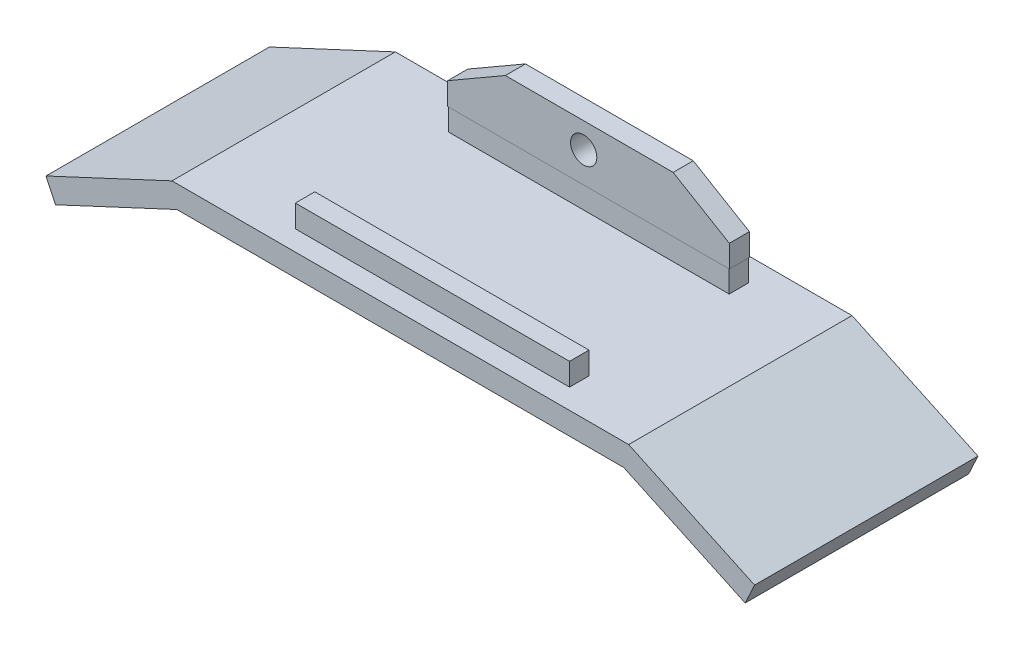
ISO-10303-21;
HEADER;
FILE_DESCRIPTION(('STEP AP214'),'2;1');
FILE_NAME('part.step','',(''),(''),'','','');
FILE_SCHEMA(('AUTOMOTIVE_DESIGN { 1 0 10303 214 1 1 1 1 }'));
ENDSEC;
DATA;
#1=APPLICATION_CONTEXT('core data for automotive mechanical design processes');
#2=APPLICATION_PROTOCOL_DEFINITION('international standard','automotive_design',2000,#1);
#3=PRODUCT_CONTEXT('',#1,'mechanical');
#4=PRODUCT('Part','Part','',(#3));
#5=PRODUCT_RELATED_PRODUCT_CATEGORY('part','',(#4));
#6=PRODUCT_DEFINITION_FORMATION('','',#4);
#7=PRODUCT_DEFINITION_CONTEXT('part definition',#1,'design');
#8=PRODUCT_DEFINITION('design','',#6,#7);
#9=PRODUCT_DEFINITION_SHAPE('','',#8);
#10=(LENGTH_UNIT() NAMED_UNIT(*) SI_UNIT(.MILLI.,.METRE.));
#11=(NAMED_UNIT(*) PLANE_ANGLE_UNIT() SI_UNIT($,.RADIAN.));
#12=(NAMED_UNIT(*) SI_UNIT($,.STERADIAN.) SOLID_ANGLE_UNIT());
#13=UNCERTAINTY_MEASURE_WITH_UNIT(LENGTH_MEASURE(1.E-05),#10,'distance_accuracy_value','');
#14=(GEOMETRIC_REPRESENTATION_CONTEXT(3) GLOBAL_UNCERTAINTY_ASSIGNED_CONTEXT((#13)) GLOBAL_UNIT_ASSIGNED_CONTEXT((#10,
#11,#12)) REPRESENTATION_CONTEXT('',''));
#15=CARTESIAN_POINT('',(0.,0.,0.));
#16=DIRECTION('',(0.,0.,1.));
#17=DIRECTION('',(1.,0.,0.));
#18=AXIS2_PLACEMENT_3D('',#15,#16,#17);
#19=CARTESIAN_POINT('',(0.,2.54,25.4));
#20=DIRECTION('',(0.,-1.,0.));
#21=DIRECTION('',(0.,0.,-1.));
#22=AXIS2_PLACEMENT_3D('',#19,#20,#21);
#23=PLANE('',#22);
#24=DIRECTION('',(1.,0.,0.));
#25=VECTOR('',#24,1.);
#26=CARTESIAN_POINT('',(10.3245978681055,2.54,4.86771388419687));
#27=LINE('',#26,#25);
#28=CARTESIAN_POINT('',(10.3245978681055,2.54,4.86771388419687));
#29=VERTEX_POINT('',#28);
#30=CARTESIAN_POINT('',(42.2640091644922,2.54,4.86771388419687));
#31=VERTEX_POINT('',#30);
#32=EDGE_CURVE('E268',#29,#31,#27,.T.);
#33=ORIENTED_EDGE('',*,*,#32,.F.);
#34=DIRECTION('',(0.,0.,1.));
#35=VECTOR('',#34,1.);
#36=CARTESIAN_POINT('',(10.3245978681055,2.54,2.65324803431406));
#37=LINE('',#36,#35);
#38=CARTESIAN_POINT('',(10.3245978681055,2.54,2.65324803431406));
#39=VERTEX_POINT('',#38);
#40=EDGE_CURVE('E274',#39,#29,#37,.T.);
#41=ORIENTED_EDGE('',*,*,#40,.F.);
#42=DIRECTION('',(1.,0.,0.));
#43=VECTOR('',#42,1.);
#44=CARTESIAN_POINT('',(10.3245978681055,2.54,2.65324803431406));
#45=LINE('',#44,#43);
#46=CARTESIAN_POINT('',(42.2640091644922,2.54,2.65324803431406));
#47=VERTEX_POINT('',#46);
#48=EDGE_CURVE('E282',#39,#47,#45,.T.);
#49=ORIENTED_EDGE('',*,*,#48,.T.);
#50=DIRECTION('',(0.,0.,1.));
#51=VECTOR('',#50,1.);
#52=CARTESIAN_POINT('',(42.2640091644922,2.54,2.65324803431406));
#53=LINE('',#52,#51);
#54=EDGE_CURVE('E280',#47,#31,#53,.T.);
#55=ORIENTED_EDGE('',*,*,#54,.T.);
#56=EDGE_LOOP('',(#33,#41,#49,#55));
#57=FACE_BOUND('',#56,.T.);
#58=DIRECTION('',(1.,0.,0.));
#59=VECTOR('',#58,1.);
#60=CARTESIAN_POINT('',(0.,2.54,0.));
#61=LINE('',#60,#59);
#62=CARTESIAN_POINT('',(51.3631044431131,2.54,0.));
#63=VERTEX_POINT('',#62);
#64=CARTESIAN_POINT('',(-0.563104443113079,2.54,0.));
#65=VERTEX_POINT('',#64);
#66=EDGE_CURVE('E300',#63,#65,#61,.F.);
#67=ORIENTED_EDGE('',*,*,#66,.T.);
#68=DIRECTION('',(0.,0.,-1.));
#69=VECTOR('',#68,1.);
#70=CARTESIAN_POINT('',(-0.563104443113079,2.54,25.4));
#71=LINE('',#70,#69);
#72=CARTESIAN_POINT('',(-0.563104443113079,2.54,25.4));
#73=VERTEX_POINT('',#72);
#74=EDGE_CURVE('E317',#73,#65,#71,.T.);
#75=ORIENTED_EDGE('',*,*,#74,.F.);
#76=DIRECTION('',(1.,0.,0.));
#77=VECTOR('',#76,1.);
#78=CARTESIAN_POINT('',(0.,2.54,25.4));
#79=LINE('',#78,#77);
#80=CARTESIAN_POINT('',(51.3631044431131,2.54,25.4));
#81=VERTEX_POINT('',#80);
#82=EDGE_CURVE('E313',#81,#73,#79,.F.);
#83=ORIENTED_EDGE('',*,*,#82,.F.);
#84=DIRECTION('',(0.,0.,-1.));
#85=VECTOR('',#84,1.);
#86=CARTESIAN_POINT('',(51.3631044431131,2.54,25.4));
#87=LINE('',#86,#85);
#88=EDGE_CURVE('E339',#81,#63,#87,.T.);
#89=ORIENTED_EDGE('',*,*,#88,.T.);
#90=EDGE_LOOP('',(#67,#75,#83,#89));
#91=FACE_BOUND('',#90,.T.);
#92=DIRECTION('',(0.,0.,1.));
#93=VECTOR('',#92,1.);
#94=CARTESIAN_POINT('',(11.1763155026758,2.54,20.893626447719));
#95=LINE('',#94,#93);
#96=CARTESIAN_POINT('',(11.1763155026758,2.54,20.893626447719));
#97=VERTEX_POINT('',#96);
#98=CARTESIAN_POINT('',(11.1763155026758,2.54,23.1080922976018));
#99=VERTEX_POINT('',#98);
#100=EDGE_CURVE('E232',#97,#99,#95,.T.);
#101=ORIENTED_EDGE('',*,*,#100,.F.);
#102=DIRECTION('',(-1.,0.,0.));
#103=VECTOR('',#102,1.);
#104=CARTESIAN_POINT('',(11.1763155026758,2.54,20.893626447719));
#105=LINE('',#104,#103);
#106=CARTESIAN_POINT('',(42.3491809279492,2.54,20.893626447719));
#107=VERTEX_POINT('',#106);
#108=EDGE_CURVE('E250',#107,#97,#105,.T.);
#109=ORIENTED_EDGE('',*,*,#108,.F.);
#110=DIRECTION('',(0.,0.,-1.));
#111=VECTOR('',#110,1.);
#112=CARTESIAN_POINT('',(42.3491809279492,2.54,20.893626447719));
#113=LINE('',#112,#111);
#114=CARTESIAN_POINT('',(42.3491809279492,2.54,23.1080922976018));
#115=VERTEX_POINT('',#114);
#116=EDGE_CURVE('E56',#115,#107,#113,.T.);
#117=ORIENTED_EDGE('',*,*,#116,.F.);
#118=DIRECTION('',(1.,0.,0.));
#119=VECTOR('',#118,1.);
#120=CARTESIAN_POINT('',(11.1763155026758,2.54,23.1080922976018));
#121=LINE('',#120,#119);
#122=EDGE_CURVE('E53',#99,#115,#121,.T.);
#123=ORIENTED_EDGE('',*,*,#122,.F.);
#124=EDGE_LOOP('',(#101,#109,#117,#123));
#125=FACE_BOUND('',#124,.T.);
#126=ADVANCED_FACE('F39',(#57,#91,#125),#23,.F.);
#127=CARTESIAN_POINT('',(-1.0734503848214,2.30202177907308,25.4));
#128=DIRECTION('',(0.422618261740707,-0.906307787036647,0.));
#129=DIRECTION('',(0.906307787036647,0.422618261740707,0.));
#130=AXIS2_PLACEMENT_3D('',#127,#128,#129);
#131=PLANE('',#130);
#132=DIRECTION('',(-0.906307787036647,-0.422618261740707,0.));
#133=VECTOR('',#132,1.);
#134=CARTESIAN_POINT('',(-1.0734503848214,2.30202177907308,0.));
#135=LINE('',#134,#133);
#136=CARTESIAN_POINT('',(-14.8855810592599,-4.13868052985529,0.));
#137=VERTEX_POINT('',#136);
#138=EDGE_CURVE('E291',#65,#137,#135,.T.);
#139=ORIENTED_EDGE('',*,*,#138,.T.);
#140=DIRECTION('',(0.,0.,-1.));
#141=VECTOR('',#140,1.);
#142=CARTESIAN_POINT('',(-14.8855810592599,-4.13868052985529,25.4));
#143=LINE('',#142,#141);
#144=CARTESIAN_POINT('',(-14.8855810592599,-4.13868052985529,25.4));
#145=VERTEX_POINT('',#144);
#146=EDGE_CURVE('E11',#145,#137,#143,.T.);
#147=ORIENTED_EDGE('',*,*,#146,.F.);
#148=DIRECTION('',(-0.906307787036647,-0.422618261740707,0.));
#149=VECTOR('',#148,1.);
#150=CARTESIAN_POINT('',(-1.0734503848214,2.30202177907308,25.4));
#151=LINE('',#150,#149);
#152=EDGE_CURVE('E295',#73,#145,#151,.T.);
#153=ORIENTED_EDGE('',*,*,#152,.F.);
#154=ORIENTED_EDGE('',*,*,#74,.T.);
#155=EDGE_LOOP('',(#139,#147,#153,#154));
#156=FACE_BOUND('',#155,.T.);
#157=ADVANCED_FACE('F41',(#156),#131,.F.);
#158=CARTESIAN_POINT('',(-13.8121306744385,-6.44070230892837,25.4));
#159=DIRECTION('',(-0.906307787036647,-0.422618261740707,0.));
#160=DIRECTION('',(0.422618261740707,-0.906307787036647,0.));
#161=AXIS2_PLACEMENT_3D('',#158,#159,#160);
#162=PLANE('',#161);
#163=DIRECTION('',(-0.422618261740707,0.906307787036647,0.));
#164=VECTOR('',#163,1.);
#165=CARTESIAN_POINT('',(-13.8121306744385,-6.44070230892837,0.));
#166=LINE('',#165,#164);
#167=CARTESIAN_POINT('',(-13.8121306744385,-6.44070230892837,0.));
#168=VERTEX_POINT('',#167);
#169=EDGE_CURVE('E316',#168,#137,#166,.T.);
#170=ORIENTED_EDGE('',*,*,#169,.F.);
#171=DIRECTION('',(0.,0.,-1.));
#172=VECTOR('',#171,1.);
#173=CARTESIAN_POINT('',(-13.8121306744385,-6.44070230892837,25.4));
#174=LINE('',#173,#172);
#175=CARTESIAN_POINT('',(-13.8121306744385,-6.44070230892837,25.4));
#176=VERTEX_POINT('',#175);
#177=EDGE_CURVE('E50',#176,#168,#174,.T.);
#178=ORIENTED_EDGE('',*,*,#177,.F.);
#179=DIRECTION('',(-0.422618261740707,0.906307787036647,0.));
#180=VECTOR('',#179,1.);
#181=CARTESIAN_POINT('',(-13.8121306744385,-6.44070230892837,25.4));
#182=LINE('',#181,#180);
#183=EDGE_CURVE('E298',#176,#145,#182,.T.);
#184=ORIENTED_EDGE('',*,*,#183,.T.);
#185=ORIENTED_EDGE('',*,*,#146,.T.);
#186=EDGE_LOOP('',(#170,#178,#184,#185));
#187=FACE_BOUND('',#186,.T.);
#188=ADVANCED_FACE('F358',(#187),#162,.T.);
#189=CARTESIAN_POINT('',(0.,0.,25.4));
#190=DIRECTION('',(0.422618261740707,-0.906307787036647,0.));
#191=DIRECTION('',(0.906307787036647,0.422618261740707,0.));
#192=AXIS2_PLACEMENT_3D('',#189,#190,#191);
#193=PLANE('',#192);
#194=DIRECTION('',(-0.906307787036647,-0.422618261740707,0.));
#195=VECTOR('',#194,1.);
#196=CARTESIAN_POINT('',(0.,0.,0.));
#197=LINE('',#196,#195);
#198=CARTESIAN_POINT('',(0.,0.,0.));
#199=VERTEX_POINT('',#198);
#200=EDGE_CURVE('E321',#199,#168,#197,.T.);
#201=ORIENTED_EDGE('',*,*,#200,.F.);
#202=DIRECTION('',(0.,0.,-1.));
#203=VECTOR('',#202,1.);
#204=CARTESIAN_POINT('',(0.,0.,25.4));
#205=LINE('',#204,#203);
#206=CARTESIAN_POINT('',(0.,0.,25.4));
#207=VERTEX_POINT('',#206);
#208=EDGE_CURVE('E349',#207,#199,#205,.T.);
#209=ORIENTED_EDGE('',*,*,#208,.F.);
#210=DIRECTION('',(-0.906307787036647,-0.422618261740707,0.));
#211=VECTOR('',#210,1.);
#212=CARTESIAN_POINT('',(0.,0.,25.4));
#213=LINE('',#212,#211);
#214=EDGE_CURVE('E297',#207,#176,#213,.T.);
#215=ORIENTED_EDGE('',*,*,#214,.T.);
#216=ORIENTED_EDGE('',*,*,#177,.T.);
#217=EDGE_LOOP('',(#201,#209,#215,#216));
#218=FACE_BOUND('',#217,.T.);
#219=ADVANCED_FACE('F354',(#218),#193,.T.);
#220=CARTESIAN_POINT('',(0.,0.,25.4));
#221=DIRECTION('',(0.,-1.,0.));
#222=DIRECTION('',(0.,0.,-1.));
#223=AXIS2_PLACEMENT_3D('',#220,#221,#222);
#224=PLANE('',#223);
#225=DIRECTION('',(-1.,0.,0.));
#226=VECTOR('',#225,1.);
#227=CARTESIAN_POINT('',(0.,0.,0.));
#228=LINE('',#227,#226);
#229=CARTESIAN_POINT('',(50.8,0.,0.));
#230=VERTEX_POINT('',#229);
#231=EDGE_CURVE('E322',#230,#199,#228,.T.);
#232=ORIENTED_EDGE('',*,*,#231,.F.);
#233=DIRECTION('',(0.,0.,-1.));
#234=VECTOR('',#233,1.);
#235=CARTESIAN_POINT('',(50.8,0.,25.4));
#236=LINE('',#235,#234);
#237=CARTESIAN_POINT('',(50.8,0.,25.4));
#238=VERTEX_POINT('',#237);
#239=EDGE_CURVE('E347',#238,#230,#236,.T.);
#240=ORIENTED_EDGE('',*,*,#239,.F.);
#241=DIRECTION('',(-1.,0.,0.));
#242=VECTOR('',#241,1.);
#243=CARTESIAN_POINT('',(0.,0.,25.4));
#244=LINE('',#243,#242);
#245=EDGE_CURVE('E303',#238,#207,#244,.T.);
#246=ORIENTED_EDGE('',*,*,#245,.T.);
#247=ORIENTED_EDGE('',*,*,#208,.T.);
#248=EDGE_LOOP('',(#232,#240,#246,#247));
#249=FACE_BOUND('',#248,.T.);
#250=ADVANCED_FACE('F364',(#249),#224,.T.);
#251=CARTESIAN_POINT('',(50.8,0.,25.4));
#252=DIRECTION('',(-0.422618261740701,-0.906307787036649,0.));
#253=DIRECTION('',(0.906307787036649,-0.422618261740701,0.));
#254=AXIS2_PLACEMENT_3D('',#251,#252,#253);
#255=PLANE('',#254);
#256=DIRECTION('',(-0.906307787036649,0.422618261740701,0.));
#257=VECTOR('',#256,1.);
#258=CARTESIAN_POINT('',(50.8,0.,0.));
#259=LINE('',#258,#257);
#260=CARTESIAN_POINT('',(64.6121306744385,-6.44070230892828,0.));
#261=VERTEX_POINT('',#260);
#262=EDGE_CURVE('E329',#261,#230,#259,.T.);
#263=ORIENTED_EDGE('',*,*,#262,.F.);
#264=DIRECTION('',(0.,0.,-1.));
#265=VECTOR('',#264,1.);
#266=CARTESIAN_POINT('',(64.6121306744385,-6.44070230892828,25.4));
#267=LINE('',#266,#265);
#268=CARTESIAN_POINT('',(64.6121306744385,-6.44070230892828,25.4));
#269=VERTEX_POINT('',#268);
#270=EDGE_CURVE('E343',#269,#261,#267,.T.);
#271=ORIENTED_EDGE('',*,*,#270,.F.);
#272=DIRECTION('',(-0.906307787036649,0.422618261740701,0.));
#273=VECTOR('',#272,1.);
#274=CARTESIAN_POINT('',(50.8,0.,25.4));
#275=LINE('',#274,#273);
#276=EDGE_CURVE('E306',#269,#238,#275,.T.);
#277=ORIENTED_EDGE('',*,*,#276,.T.);
#278=ORIENTED_EDGE('',*,*,#239,.T.);
#279=EDGE_LOOP('',(#263,#271,#277,#278));
#280=FACE_BOUND('',#279,.T.);
#281=ADVANCED_FACE('F383',(#280),#255,.T.);
#282=CARTESIAN_POINT('',(65.6855810592599,-4.13868052985519,25.4));
#283=DIRECTION('',(0.906307787036648,-0.422618261740703,0.));
#284=DIRECTION('',(0.422618261740703,0.906307787036648,0.));
#285=AXIS2_PLACEMENT_3D('',#282,#283,#284);
#286=PLANE('',#285);
#287=DIRECTION('',(-0.422618261740703,-0.906307787036648,0.));
#288=VECTOR('',#287,1.);
#289=CARTESIAN_POINT('',(65.6855810592599,-4.13868052985519,0.));
#290=LINE('',#289,#288);
#291=CARTESIAN_POINT('',(65.6855810592599,-4.13868052985519,0.));
#292=VERTEX_POINT('',#291);
#293=EDGE_CURVE('E332',#292,#261,#290,.T.);
#294=ORIENTED_EDGE('',*,*,#293,.F.);
#295=DIRECTION('',(0.,0.,-1.));
#296=VECTOR('',#295,1.);
#297=CARTESIAN_POINT('',(65.6855810592599,-4.13868052985519,25.4));
#298=LINE('',#297,#296);
#299=CARTESIAN_POINT('',(65.6855810592599,-4.13868052985519,25.4));
#300=VERTEX_POINT('',#299);
#301=EDGE_CURVE('E341',#300,#292,#298,.T.);
#302=ORIENTED_EDGE('',*,*,#301,.F.);
#303=DIRECTION('',(-0.422618261740703,-0.906307787036648,0.));
#304=VECTOR('',#303,1.);
#305=CARTESIAN_POINT('',(65.6855810592599,-4.13868052985519,25.4));
#306=LINE('',#305,#304);
#307=EDGE_CURVE('E307',#300,#269,#306,.T.);
#308=ORIENTED_EDGE('',*,*,#307,.T.);
#309=ORIENTED_EDGE('',*,*,#270,.T.);
#310=EDGE_LOOP('',(#294,#302,#308,#309));
#311=FACE_BOUND('',#310,.T.);
#312=ADVANCED_FACE('F384',(#311),#286,.T.);
#313=CARTESIAN_POINT('',(51.8734503848214,2.30202177907309,25.4));
#314=DIRECTION('',(-0.422618261740701,-0.906307787036649,0.));
#315=DIRECTION('',(0.906307787036649,-0.422618261740701,0.));
#316=AXIS2_PLACEMENT_3D('',#313,#314,#315);
#317=PLANE('',#316);
#318=DIRECTION('',(-0.906307787036649,0.422618261740701,0.));
#319=VECTOR('',#318,1.);
#320=CARTESIAN_POINT('',(51.8734503848214,2.30202177907309,0.));
#321=LINE('',#320,#319);
#322=EDGE_CURVE('E331',#292,#63,#321,.T.);
#323=ORIENTED_EDGE('',*,*,#322,.T.);
#324=ORIENTED_EDGE('',*,*,#88,.F.);
#325=DIRECTION('',(-0.906307787036649,0.422618261740701,0.));
#326=VECTOR('',#325,1.);
#327=CARTESIAN_POINT('',(51.8734503848214,2.30202177907309,25.4));
#328=LINE('',#327,#326);
#329=EDGE_CURVE('E315',#300,#81,#328,.T.);
#330=ORIENTED_EDGE('',*,*,#329,.F.);
#331=ORIENTED_EDGE('',*,*,#301,.T.);
#332=EDGE_LOOP('',(#323,#324,#330,#331));
#333=FACE_BOUND('',#332,.T.);
#334=ADVANCED_FACE('F379',(#333),#317,.F.);
#335=CARTESIAN_POINT('',(0.,0.,25.4));
#336=DIRECTION('',(0.,0.,-1.));
#337=DIRECTION('',(-1.,0.,0.));
#338=AXIS2_PLACEMENT_3D('',#335,#336,#337);
#339=PLANE('',#338);
#340=ORIENTED_EDGE('',*,*,#152,.T.);
#341=ORIENTED_EDGE('',*,*,#183,.F.);
#342=ORIENTED_EDGE('',*,*,#214,.F.);
#343=ORIENTED_EDGE('',*,*,#245,.F.);
#344=ORIENTED_EDGE('',*,*,#276,.F.);
#345=ORIENTED_EDGE('',*,*,#307,.F.);
#346=ORIENTED_EDGE('',*,*,#329,.T.);
#347=ORIENTED_EDGE('',*,*,#82,.T.);
#348=EDGE_LOOP('',(#340,#341,#342,#343,#344,#345,#346,#347));
#349=FACE_BOUND('',#348,.T.);
#350=ADVANCED_FACE('F370',(#349),#339,.F.);
#351=CARTESIAN_POINT('',(0.,0.,0.));
#352=DIRECTION('',(0.,0.,-1.));
#353=DIRECTION('',(-1.,0.,0.));
#354=AXIS2_PLACEMENT_3D('',#351,#352,#353);
#355=PLANE('',#354);
#356=ORIENTED_EDGE('',*,*,#138,.F.);
#357=ORIENTED_EDGE('',*,*,#66,.F.);
#358=ORIENTED_EDGE('',*,*,#322,.F.);
#359=ORIENTED_EDGE('',*,*,#293,.T.);
#360=ORIENTED_EDGE('',*,*,#262,.T.);
#361=ORIENTED_EDGE('',*,*,#231,.T.);
#362=ORIENTED_EDGE('',*,*,#200,.T.);
#363=ORIENTED_EDGE('',*,*,#169,.T.);
#364=EDGE_LOOP('',(#356,#357,#358,#359,#360,#361,#362,#363));
#365=FACE_BOUND('',#364,.T.);
#366=ADVANCED_FACE('F359',(#365),#355,.T.);
#367=CARTESIAN_POINT('',(10.3245978681055,5.08,4.86771388419687));
#368=DIRECTION('',(0.,0.,-1.));
#369=DIRECTION('',(-1.,0.,0.));
#370=AXIS2_PLACEMENT_3D('',#367,#368,#369);
#371=PLANE('',#370);
#372=ORIENTED_EDGE('',*,*,#32,.T.);
#373=DIRECTION('',(0.,-1.,0.));
#374=VECTOR('',#373,1.);
#375=CARTESIAN_POINT('',(42.2640091644922,5.08,4.86771388419687));
#376=LINE('',#375,#374);
#377=CARTESIAN_POINT('',(42.2640091644922,5.08,4.86771388419687));
#378=VERTEX_POINT('',#377);
#379=EDGE_CURVE('E288',#378,#31,#376,.T.);
#380=ORIENTED_EDGE('',*,*,#379,.F.);
#381=DIRECTION('',(1.,0.,0.));
#382=VECTOR('',#381,1.);
#383=CARTESIAN_POINT('',(10.3245978681055,5.08,4.86771388419687));
#384=LINE('',#383,#382);
#385=CARTESIAN_POINT('',(10.3245978681055,5.08,4.86771388419687));
#386=VERTEX_POINT('',#385);
#387=EDGE_CURVE('E272',#386,#378,#384,.T.);
#388=ORIENTED_EDGE('',*,*,#387,.F.);
#389=DIRECTION('',(0.,-1.,0.));
#390=VECTOR('',#389,1.);
#391=CARTESIAN_POINT('',(10.3245978681055,5.08,4.86771388419687));
#392=LINE('',#391,#390);
#393=EDGE_CURVE('E184',#386,#29,#392,.T.);
#394=ORIENTED_EDGE('',*,*,#393,.T.);
#395=EDGE_LOOP('',(#372,#380,#388,#394));
#396=FACE_BOUND('',#395,.T.);
#397=ADVANCED_FACE('F415',(#396),#371,.F.);
#398=CARTESIAN_POINT('',(42.2640091644922,5.08,2.65324803431406));
#399=DIRECTION('',(1.,0.,0.));
#400=DIRECTION('',(0.,0.,-1.));
#401=AXIS2_PLACEMENT_3D('',#398,#399,#400);
#402=PLANE('',#401);
#403=ORIENTED_EDGE('',*,*,#54,.F.);
#404=DIRECTION('',(0.,-1.,0.));
#405=VECTOR('',#404,1.);
#406=CARTESIAN_POINT('',(42.2640091644922,5.08,2.65324803431406));
#407=LINE('',#406,#405);
#408=CARTESIAN_POINT('',(42.2640091644922,5.08,2.65324803431406));
#409=VERTEX_POINT('',#408);
#410=EDGE_CURVE('E290',#409,#47,#407,.T.);
#411=ORIENTED_EDGE('',*,*,#410,.F.);
#412=DIRECTION('',(0.,0.,1.));
#413=VECTOR('',#412,1.);
#414=CARTESIAN_POINT('',(42.2640091644922,5.08,2.65324803431406));
#415=LINE('',#414,#413);
#416=EDGE_CURVE('E271',#409,#378,#415,.T.);
#417=ORIENTED_EDGE('',*,*,#416,.T.);
#418=ORIENTED_EDGE('',*,*,#379,.T.);
#419=EDGE_LOOP('',(#403,#411,#417,#418));
#420=FACE_BOUND('',#419,.T.);
#421=ADVANCED_FACE('F417',(#420),#402,.T.);
#422=CARTESIAN_POINT('',(10.3245978681055,5.08,2.65324803431406));
#423=DIRECTION('',(0.,0.,-1.));
#424=DIRECTION('',(-1.,0.,0.));
#425=AXIS2_PLACEMENT_3D('',#422,#423,#424);
#426=PLANE('',#425);
#427=CARTESIAN_POINT('',(25.7896711246282,8.53553220076982,2.65324803431406));
#428=DIRECTION('',(0.,0.,-1.));
#429=DIRECTION('',(-1.,0.,0.));
#430=AXIS2_PLACEMENT_3D('',#427,#428,#429);
#431=CIRCLE('',#430,1.4919462790934);
#432=CARTESIAN_POINT('',(24.2977248455348,8.53553220076982,2.65324803431406));
#433=VERTEX_POINT('',#432);
#434=EDGE_CURVE('E211',#433,#433,#431,.T.);
#435=ORIENTED_EDGE('',*,*,#434,.F.);
#436=EDGE_LOOP('',(#435));
#437=FACE_BOUND('',#436,.T.);
#438=ORIENTED_EDGE('',*,*,#48,.F.);
#439=DIRECTION('',(0.,-1.,0.));
#440=VECTOR('',#439,1.);
#441=CARTESIAN_POINT('',(10.3245978681055,5.08,2.65324803431406));
#442=LINE('',#441,#440);
#443=CARTESIAN_POINT('',(10.3245978681055,7.62,2.65324803431406));
#444=VERTEX_POINT('',#443);
#445=EDGE_CURVE('E287',#444,#39,#442,.T.);
#446=ORIENTED_EDGE('',*,*,#445,.F.);
#447=DIRECTION('',(0.866025403784438,0.500000000000001,0.));
#448=VECTOR('',#447,1.);
#449=CARTESIAN_POINT('',(16.8832559250837,11.4066429947191,2.65324803431406));
#450=LINE('',#449,#448);
#451=CARTESIAN_POINT('',(16.8832559250837,11.4066429947191,2.65324803431406));
#452=VERTEX_POINT('',#451);
#453=EDGE_CURVE('E228',#444,#452,#450,.T.);
#454=ORIENTED_EDGE('',*,*,#453,.T.);
#455=DIRECTION('',(1.,0.,0.));
#456=VECTOR('',#455,1.);
#457=CARTESIAN_POINT('',(35.9617309394587,11.4066429947191,2.65324803431406));
#458=LINE('',#457,#456);
#459=CARTESIAN_POINT('',(35.9617309394587,11.4066429947191,2.65324803431406));
#460=VERTEX_POINT('',#459);
#461=EDGE_CURVE('E230',#452,#460,#458,.T.);
#462=ORIENTED_EDGE('',*,*,#461,.T.);
#463=DIRECTION('',(0.860203666666359,-0.509950636683348,0.));
#464=VECTOR('',#463,1.);
#465=CARTESIAN_POINT('',(42.3491809279492,7.62,2.65324803431406));
#466=LINE('',#465,#464);
#467=CARTESIAN_POINT('',(42.3491809279492,7.62,2.65324803431406));
#468=VERTEX_POINT('',#467);
#469=EDGE_CURVE('E209',#460,#468,#466,.T.);
#470=ORIENTED_EDGE('',*,*,#469,.T.);
#471=DIRECTION('',(0.,-1.,0.));
#472=VECTOR('',#471,1.);
#473=CARTESIAN_POINT('',(42.3491809279492,5.08,2.65324803431406));
#474=LINE('',#473,#472);
#475=CARTESIAN_POINT('',(42.3491809279492,5.08,2.65324803431406));
#476=VERTEX_POINT('',#475);
#477=EDGE_CURVE('E207',#468,#476,#474,.T.);
#478=ORIENTED_EDGE('',*,*,#477,.T.);
#479=DIRECTION('',(-1.,0.,0.));
#480=VECTOR('',#479,1.);
#481=CARTESIAN_POINT('',(42.3491809279492,5.08,2.65324803431406));
#482=LINE('',#481,#480);
#483=EDGE_CURVE('E225',#476,#409,#482,.T.);
#484=ORIENTED_EDGE('',*,*,#483,.T.);
#485=ORIENTED_EDGE('',*,*,#410,.T.);
#486=EDGE_LOOP('',(#438,#446,#454,#462,#470,#478,#484,#485));
#487=FACE_BOUND('',#486,.T.);
#488=ADVANCED_FACE('F418',(#437,#487),#426,.T.);
#489=CARTESIAN_POINT('',(10.3245978681055,5.08,2.65324803431406));
#490=DIRECTION('',(1.,0.,0.));
#491=DIRECTION('',(0.,0.,-1.));
#492=AXIS2_PLACEMENT_3D('',#489,#490,#491);
#493=PLANE('',#492);
#494=ORIENTED_EDGE('',*,*,#40,.T.);
#495=ORIENTED_EDGE('',*,*,#393,.F.);
#496=DIRECTION('',(0.,0.,-1.));
#497=VECTOR('',#496,1.);
#498=CARTESIAN_POINT('',(10.3245978681055,5.08,4.93924803431406));
#499=LINE('',#498,#497);
#500=CARTESIAN_POINT('',(10.3245978681055,5.08,4.93924803431406));
#501=VERTEX_POINT('',#500);
#502=EDGE_CURVE('E177',#501,#386,#499,.T.);
#503=ORIENTED_EDGE('',*,*,#502,.F.);
#504=DIRECTION('',(0.,1.,0.));
#505=VECTOR('',#504,1.);
#506=CARTESIAN_POINT('',(10.3245978681055,7.62,4.93924803431406));
#507=LINE('',#506,#505);
#508=CARTESIAN_POINT('',(10.3245978681055,7.62,4.93924803431406));
#509=VERTEX_POINT('',#508);
#510=EDGE_CURVE('E182',#501,#509,#507,.T.);
#511=ORIENTED_EDGE('',*,*,#510,.T.);
#512=DIRECTION('',(0.,0.,-1.));
#513=VECTOR('',#512,1.);
#514=CARTESIAN_POINT('',(10.3245978681055,7.62,4.93924803431406));
#515=LINE('',#514,#513);
#516=EDGE_CURVE('E186',#509,#444,#515,.T.);
#517=ORIENTED_EDGE('',*,*,#516,.T.);
#518=ORIENTED_EDGE('',*,*,#445,.T.);
#519=EDGE_LOOP('',(#494,#495,#503,#511,#517,#518));
#520=FACE_BOUND('',#519,.T.);
#521=ADVANCED_FACE('F181',(#520),#493,.F.);
#522=CARTESIAN_POINT('',(11.1763155026758,5.08,20.893626447719));
#523=DIRECTION('',(1.,0.,0.));
#524=DIRECTION('',(0.,0.,-1.));
#525=AXIS2_PLACEMENT_3D('',#522,#523,#524);
#526=PLANE('',#525);
#527=ORIENTED_EDGE('',*,*,#100,.T.);
#528=DIRECTION('',(0.,-1.,0.));
#529=VECTOR('',#528,1.);
#530=CARTESIAN_POINT('',(11.1763155026758,5.08,23.1080922976018));
#531=LINE('',#530,#529);
#532=CARTESIAN_POINT('',(11.1763155026758,5.08,23.1080922976018));
#533=VERTEX_POINT('',#532);
#534=EDGE_CURVE('E270',#533,#99,#531,.T.);
#535=ORIENTED_EDGE('',*,*,#534,.F.);
#536=DIRECTION('',(0.,0.,1.));
#537=VECTOR('',#536,1.);
#538=CARTESIAN_POINT('',(11.1763155026758,5.08,20.893626447719));
#539=LINE('',#538,#537);
#540=CARTESIAN_POINT('',(11.1763155026758,5.08,20.893626447719));
#541=VERTEX_POINT('',#540);
#542=EDGE_CURVE('E243',#541,#533,#539,.T.);
#543=ORIENTED_EDGE('',*,*,#542,.F.);
#544=DIRECTION('',(0.,-1.,0.));
#545=VECTOR('',#544,1.);
#546=CARTESIAN_POINT('',(11.1763155026758,5.08,20.893626447719));
#547=LINE('',#546,#545);
#548=EDGE_CURVE('E254',#541,#97,#547,.T.);
#549=ORIENTED_EDGE('',*,*,#548,.T.);
#550=EDGE_LOOP('',(#527,#535,#543,#549));
#551=FACE_BOUND('',#550,.T.);
#552=ADVANCED_FACE('F430',(#551),#526,.F.);
#553=CARTESIAN_POINT('',(11.1763155026758,5.08,23.1080922976018));
#554=DIRECTION('',(0.,0.,-1.));
#555=DIRECTION('',(-1.,0.,0.));
#556=AXIS2_PLACEMENT_3D('',#553,#554,#555);
#557=PLANE('',#556);
#558=ORIENTED_EDGE('',*,*,#122,.T.);
#559=DIRECTION('',(0.,-1.,0.));
#560=VECTOR('',#559,1.);
#561=CARTESIAN_POINT('',(42.3491809279492,5.08,23.1080922976018));
#562=LINE('',#561,#560);
#563=CARTESIAN_POINT('',(42.3491809279492,5.08,23.1080922976018));
#564=VERTEX_POINT('',#563);
#565=EDGE_CURVE('E263',#564,#115,#562,.T.);
#566=ORIENTED_EDGE('',*,*,#565,.F.);
#567=DIRECTION('',(1.,0.,0.));
#568=VECTOR('',#567,1.);
#569=CARTESIAN_POINT('',(11.1763155026758,5.08,23.1080922976018));
#570=LINE('',#569,#568);
#571=EDGE_CURVE('E246',#533,#564,#570,.T.);
#572=ORIENTED_EDGE('',*,*,#571,.F.);
#573=ORIENTED_EDGE('',*,*,#534,.T.);
#574=EDGE_LOOP('',(#558,#566,#572,#573));
#575=FACE_BOUND('',#574,.T.);
#576=ADVANCED_FACE('F429',(#575),#557,.F.);
#577=CARTESIAN_POINT('',(42.3491809279492,5.08,20.893626447719));
#578=DIRECTION('',(-1.,0.,0.));
#579=DIRECTION('',(0.,0.,1.));
#580=AXIS2_PLACEMENT_3D('',#577,#578,#579);
#581=PLANE('',#580);
#582=ORIENTED_EDGE('',*,*,#116,.T.);
#583=DIRECTION('',(0.,-1.,0.));
#584=VECTOR('',#583,1.);
#585=CARTESIAN_POINT('',(42.3491809279492,5.08,20.893626447719));
#586=LINE('',#585,#584);
#587=CARTESIAN_POINT('',(42.3491809279492,5.08,20.893626447719));
#588=VERTEX_POINT('',#587);
#589=EDGE_CURVE('E265',#588,#107,#586,.T.);
#590=ORIENTED_EDGE('',*,*,#589,.F.);
#591=DIRECTION('',(0.,0.,-1.));
#592=VECTOR('',#591,1.);
#593=CARTESIAN_POINT('',(42.3491809279492,5.08,20.893626447719));
#594=LINE('',#593,#592);
#595=EDGE_CURVE('E248',#564,#588,#594,.T.);
#596=ORIENTED_EDGE('',*,*,#595,.F.);
#597=ORIENTED_EDGE('',*,*,#565,.T.);
#598=EDGE_LOOP('',(#582,#590,#596,#597));
#599=FACE_BOUND('',#598,.T.);
#600=ADVANCED_FACE('F433',(#599),#581,.F.);
#601=CARTESIAN_POINT('',(11.1763155026758,5.08,20.893626447719));
#602=DIRECTION('',(0.,0.,1.));
#603=DIRECTION('',(1.,0.,0.));
#604=AXIS2_PLACEMENT_3D('',#601,#602,#603);
#605=PLANE('',#604);
#606=ORIENTED_EDGE('',*,*,#108,.T.);
#607=ORIENTED_EDGE('',*,*,#548,.F.);
#608=DIRECTION('',(-1.,0.,0.));
#609=VECTOR('',#608,1.);
#610=CARTESIAN_POINT('',(11.1763155026758,5.08,20.893626447719));
#611=LINE('',#610,#609);
#612=EDGE_CURVE('E252',#588,#541,#611,.T.);
#613=ORIENTED_EDGE('',*,*,#612,.F.);
#614=ORIENTED_EDGE('',*,*,#589,.T.);
#615=EDGE_LOOP('',(#606,#607,#613,#614));
#616=FACE_BOUND('',#615,.T.);
#617=ADVANCED_FACE('F440',(#616),#605,.F.);
#618=CARTESIAN_POINT('',(0.,5.08,0.));
#619=DIRECTION('',(0.,1.,0.));
#620=DIRECTION('',(0.,0.,1.));
#621=AXIS2_PLACEMENT_3D('',#618,#619,#620);
#622=PLANE('',#621);
#623=ORIENTED_EDGE('',*,*,#542,.T.);
#624=ORIENTED_EDGE('',*,*,#571,.T.);
#625=ORIENTED_EDGE('',*,*,#595,.T.);
#626=ORIENTED_EDGE('',*,*,#612,.T.);
#627=EDGE_LOOP('',(#623,#624,#625,#626));
#628=FACE_BOUND('',#627,.T.);
#629=ADVANCED_FACE('F441',(#628),#622,.T.);
#630=CARTESIAN_POINT('',(42.3491809279492,5.08,4.93924803431406));
#631=DIRECTION('',(0.,-1.,0.));
#632=DIRECTION('',(0.,0.,-1.));
#633=AXIS2_PLACEMENT_3D('',#630,#631,#632);
#634=PLANE('',#633);
#635=ORIENTED_EDGE('',*,*,#502,.T.);
#636=ORIENTED_EDGE('',*,*,#387,.T.);
#637=ORIENTED_EDGE('',*,*,#416,.F.);
#638=ORIENTED_EDGE('',*,*,#483,.F.);
#639=DIRECTION('',(0.,0.,-1.));
#640=VECTOR('',#639,1.);
#641=CARTESIAN_POINT('',(42.3491809279492,5.08,4.93924803431406));
#642=LINE('',#641,#640);
#643=CARTESIAN_POINT('',(42.3491809279492,5.08,4.93924803431406));
#644=VERTEX_POINT('',#643);
#645=EDGE_CURVE('E203',#644,#476,#642,.T.);
#646=ORIENTED_EDGE('',*,*,#645,.F.);
#647=DIRECTION('',(-1.,0.,0.));
#648=VECTOR('',#647,1.);
#649=CARTESIAN_POINT('',(42.3491809279492,5.08,4.93924803431406));
#650=LINE('',#649,#648);
#651=EDGE_CURVE('E200',#644,#501,#650,.T.);
#652=ORIENTED_EDGE('',*,*,#651,.T.);
#653=EDGE_LOOP('',(#635,#636,#637,#638,#646,#652));
#654=FACE_BOUND('',#653,.T.);
#655=ADVANCED_FACE('F205',(#654),#634,.T.);
#656=CARTESIAN_POINT('',(42.3491809279492,5.08,4.93924803431406));
#657=DIRECTION('',(1.,0.,0.));
#658=DIRECTION('',(0.,0.,-1.));
#659=AXIS2_PLACEMENT_3D('',#656,#657,#658);
#660=PLANE('',#659);
#661=ORIENTED_EDGE('',*,*,#477,.F.);
#662=DIRECTION('',(0.,0.,-1.));
#663=VECTOR('',#662,1.);
#664=CARTESIAN_POINT('',(42.3491809279492,7.62,4.93924803431406));
#665=LINE('',#664,#663);
#666=CARTESIAN_POINT('',(42.3491809279492,7.62,4.93924803431406));
#667=VERTEX_POINT('',#666);
#668=EDGE_CURVE('E236',#667,#468,#665,.T.);
#669=ORIENTED_EDGE('',*,*,#668,.F.);
#670=DIRECTION('',(0.,-1.,0.));
#671=VECTOR('',#670,1.);
#672=CARTESIAN_POINT('',(42.3491809279492,5.08,4.93924803431406));
#673=LINE('',#672,#671);
#674=EDGE_CURVE('E188',#667,#644,#673,.T.);
#675=ORIENTED_EDGE('',*,*,#674,.T.);
#676=ORIENTED_EDGE('',*,*,#645,.T.);
#677=EDGE_LOOP('',(#661,#669,#675,#676));
#678=FACE_BOUND('',#677,.T.);
#679=ADVANCED_FACE('F449',(#678),#660,.T.);
#680=CARTESIAN_POINT('',(42.3491809279492,7.62,4.93924803431406));
#681=DIRECTION('',(0.509950636683348,0.860203666666359,0.));
#682=DIRECTION('',(-0.860203666666359,0.509950636683348,0.));
#683=AXIS2_PLACEMENT_3D('',#680,#681,#682);
#684=PLANE('',#683);
#685=ORIENTED_EDGE('',*,*,#469,.F.);
#686=DIRECTION('',(0.,0.,-1.));
#687=VECTOR('',#686,1.);
#688=CARTESIAN_POINT('',(35.9617309394587,11.4066429947191,4.93924803431406));
#689=LINE('',#688,#687);
#690=CARTESIAN_POINT('',(35.9617309394587,11.4066429947191,4.93924803431406));
#691=VERTEX_POINT('',#690);
#692=EDGE_CURVE('E238',#691,#460,#689,.T.);
#693=ORIENTED_EDGE('',*,*,#692,.F.);
#694=DIRECTION('',(0.860203666666359,-0.509950636683348,0.));
#695=VECTOR('',#694,1.);
#696=CARTESIAN_POINT('',(42.3491809279492,7.62,4.93924803431406));
#697=LINE('',#696,#695);
#698=EDGE_CURVE('E216',#691,#667,#697,.T.);
#699=ORIENTED_EDGE('',*,*,#698,.T.);
#700=ORIENTED_EDGE('',*,*,#668,.T.);
#701=EDGE_LOOP('',(#685,#693,#699,#700));
#702=FACE_BOUND('',#701,.T.);
#703=ADVANCED_FACE('F457',(#702),#684,.T.);
#704=CARTESIAN_POINT('',(35.9617309394587,11.4066429947191,4.93924803431406));
#705=DIRECTION('',(0.,1.,0.));
#706=DIRECTION('',(0.,0.,1.));
#707=AXIS2_PLACEMENT_3D('',#704,#705,#706);
#708=PLANE('',#707);
#709=ORIENTED_EDGE('',*,*,#461,.F.);
#710=DIRECTION('',(0.,0.,-1.));
#711=VECTOR('',#710,1.);
#712=CARTESIAN_POINT('',(16.8832559250837,11.4066429947191,4.93924803431406));
#713=LINE('',#712,#711);
#714=CARTESIAN_POINT('',(16.8832559250837,11.4066429947191,4.93924803431406));
#715=VERTEX_POINT('',#714);
#716=EDGE_CURVE('E239',#715,#452,#713,.T.);
#717=ORIENTED_EDGE('',*,*,#716,.F.);
#718=DIRECTION('',(1.,0.,0.));
#719=VECTOR('',#718,1.);
#720=CARTESIAN_POINT('',(35.9617309394587,11.4066429947191,4.93924803431406));
#721=LINE('',#720,#719);
#722=EDGE_CURVE('E217',#715,#691,#721,.T.);
#723=ORIENTED_EDGE('',*,*,#722,.T.);
#724=ORIENTED_EDGE('',*,*,#692,.T.);
#725=EDGE_LOOP('',(#709,#717,#723,#724));
#726=FACE_BOUND('',#725,.T.);
#727=ADVANCED_FACE('F451',(#726),#708,.T.);
#728=CARTESIAN_POINT('',(16.8832559250837,11.4066429947191,4.93924803431406));
#729=DIRECTION('',(-0.500000000000001,0.866025403784438,0.));
#730=DIRECTION('',(-0.866025403784438,-0.500000000000001,0.));
#731=AXIS2_PLACEMENT_3D('',#728,#729,#730);
#732=PLANE('',#731);
#733=ORIENTED_EDGE('',*,*,#453,.F.);
#734=ORIENTED_EDGE('',*,*,#516,.F.);
#735=DIRECTION('',(0.866025403784438,0.500000000000001,0.));
#736=VECTOR('',#735,1.);
#737=CARTESIAN_POINT('',(16.8832559250837,11.4066429947191,4.93924803431406));
#738=LINE('',#737,#736);
#739=EDGE_CURVE('E202',#509,#715,#738,.T.);
#740=ORIENTED_EDGE('',*,*,#739,.T.);
#741=ORIENTED_EDGE('',*,*,#716,.T.);
#742=EDGE_LOOP('',(#733,#734,#740,#741));
#743=FACE_BOUND('',#742,.T.);
#744=ADVANCED_FACE('F446',(#743),#732,.T.);
#745=CARTESIAN_POINT('',(0.,0.,4.93924803431406));
#746=DIRECTION('',(0.,0.,1.));
#747=DIRECTION('',(1.,0.,0.));
#748=AXIS2_PLACEMENT_3D('',#745,#746,#747);
#749=PLANE('',#748);
#750=CARTESIAN_POINT('',(25.7896711246282,8.53553220076982,4.93924803431406));
#751=DIRECTION('',(0.,0.,1.));
#752=DIRECTION('',(1.,0.,0.));
#753=AXIS2_PLACEMENT_3D('',#750,#751,#752);
#754=CIRCLE('',#753,1.4919462790934);
#755=CARTESIAN_POINT('',(27.2816174037216,8.53553220076982,4.93924803431406));
#756=VERTEX_POINT('',#755);
#757=EDGE_CURVE('E480',#756,#756,#754,.T.);
#758=ORIENTED_EDGE('',*,*,#757,.F.);
#759=EDGE_LOOP('',(#758));
#760=FACE_BOUND('',#759,.T.);
#761=ORIENTED_EDGE('',*,*,#651,.F.);
#762=ORIENTED_EDGE('',*,*,#674,.F.);
#763=ORIENTED_EDGE('',*,*,#698,.F.);
#764=ORIENTED_EDGE('',*,*,#722,.F.);
#765=ORIENTED_EDGE('',*,*,#739,.F.);
#766=ORIENTED_EDGE('',*,*,#510,.F.);
#767=EDGE_LOOP('',(#761,#762,#763,#764,#765,#766));
#768=FACE_BOUND('',#767,.T.);
#769=ADVANCED_FACE('F192',(#760,#768),#749,.T.);
#770=CARTESIAN_POINT('',(25.7896711246282,8.53553220076982,0.));
#771=DIRECTION('',(0.,0.,1.));
#772=DIRECTION('',(1.,0.,0.));
#773=AXIS2_PLACEMENT_3D('',#770,#771,#772);
#774=CYLINDRICAL_SURFACE('',#773,1.4919462790934);
#775=ORIENTED_EDGE('',*,*,#434,.T.);
#776=EDGE_LOOP('',(#775));
#777=FACE_BOUND('',#776,.T.);
#778=ORIENTED_EDGE('',*,*,#757,.T.);
#779=EDGE_LOOP('',(#778));
#780=FACE_BOUND('',#779,.T.);
#781=ADVANCED_FACE('F467',(#777,#780),#774,.F.);
#782=CLOSED_SHELL('',(#126,#157,#188,#219,#250,#281,#312,#334,#350,#366,#397,#421,#488,#521,
#552,#576,#600,#617,#629,#655,#679,#703,#727,#744,#769,#781));
#783=MANIFOLD_SOLID_BREP('B2',#782);
#784=ADVANCED_BREP_SHAPE_REPRESENTATION('',(#18,#783),#14);
#785=SHAPE_DEFINITION_REPRESENTATION(#9,#784);
ENDSEC;
END-ISO-10303-21;
